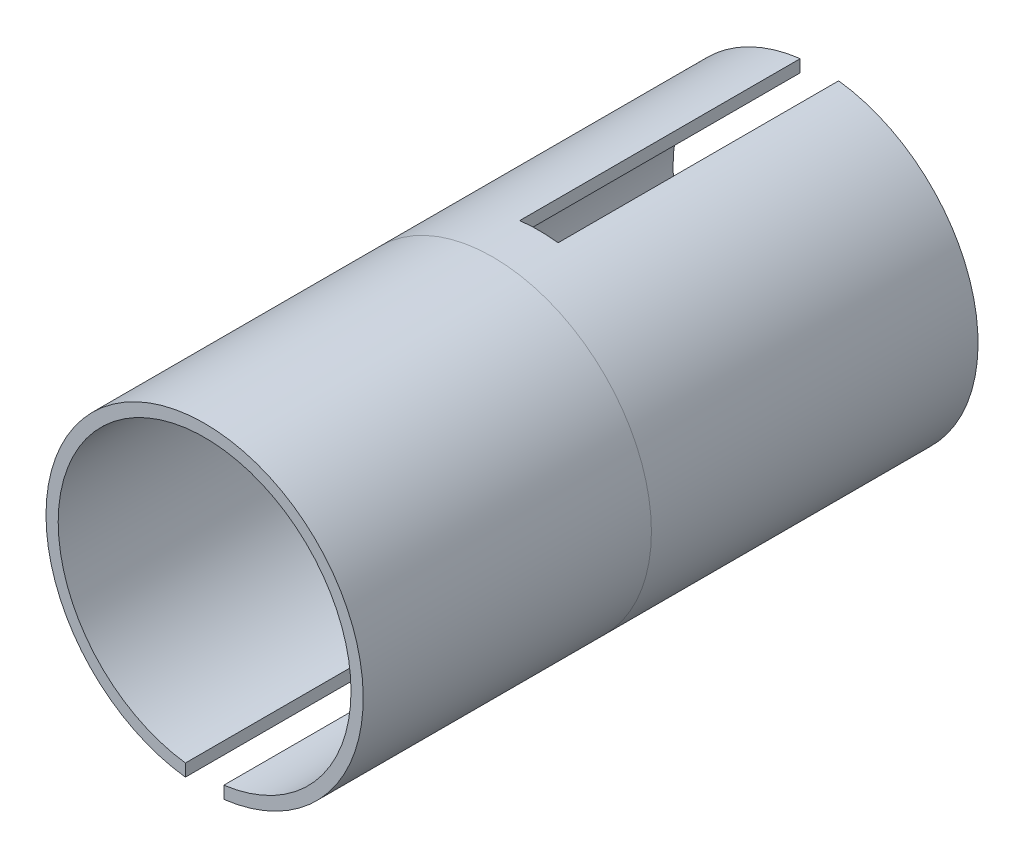
ISO-10303-21;
HEADER;
FILE_DESCRIPTION(('STEP AP214'),'2;1');
FILE_NAME('part.step','',(''),(''),'','','');
FILE_SCHEMA(('AUTOMOTIVE_DESIGN { 1 0 10303 214 1 1 1 1 }'));
ENDSEC;
DATA;
#1=APPLICATION_CONTEXT('core data for automotive mechanical design processes');
#2=APPLICATION_PROTOCOL_DEFINITION('international standard','automotive_design',2000,#1);
#3=PRODUCT_CONTEXT('',#1,'mechanical');
#4=PRODUCT('Part','Part','',(#3));
#5=PRODUCT_RELATED_PRODUCT_CATEGORY('part','',(#4));
#6=PRODUCT_DEFINITION_FORMATION('','',#4);
#7=PRODUCT_DEFINITION_CONTEXT('part definition',#1,'design');
#8=PRODUCT_DEFINITION('design','',#6,#7);
#9=PRODUCT_DEFINITION_SHAPE('','',#8);
#10=(LENGTH_UNIT() NAMED_UNIT(*) SI_UNIT(.MILLI.,.METRE.));
#11=(NAMED_UNIT(*) PLANE_ANGLE_UNIT() SI_UNIT($,.RADIAN.));
#12=(NAMED_UNIT(*) SI_UNIT($,.STERADIAN.) SOLID_ANGLE_UNIT());
#13=UNCERTAINTY_MEASURE_WITH_UNIT(LENGTH_MEASURE(1.E-05),#10,'distance_accuracy_value','');
#14=(GEOMETRIC_REPRESENTATION_CONTEXT(3) GLOBAL_UNCERTAINTY_ASSIGNED_CONTEXT((#13)) GLOBAL_UNIT_ASSIGNED_CONTEXT((#10,
#11,#12)) REPRESENTATION_CONTEXT('',''));
#15=CARTESIAN_POINT('',(0.,0.,0.));
#16=DIRECTION('',(0.,0.,1.));
#17=DIRECTION('',(1.,0.,0.));
#18=AXIS2_PLACEMENT_3D('',#15,#16,#17);
#19=CARTESIAN_POINT('',(0.,0.,85.));
#20=DIRECTION('',(0.,0.,-1.));
#21=DIRECTION('',(-1.,0.,0.));
#22=AXIS2_PLACEMENT_3D('',#19,#20,#21);
#23=PLANE('',#22);
#24=CARTESIAN_POINT('',(0.,0.,85.));
#25=DIRECTION('',(0.,0.,-1.));
#26=DIRECTION('',(-1.,0.,0.));
#27=AXIS2_PLACEMENT_3D('',#24,#25,#26);
#28=CIRCLE('',#27,41.275);
#29=CARTESIAN_POINT('',(-41.275,0.,85.));
#30=VERTEX_POINT('',#29);
#31=EDGE_CURVE('E57',#30,#30,#28,.T.);
#32=ORIENTED_EDGE('',*,*,#31,.T.);
#33=EDGE_LOOP('',(#32));
#34=FACE_BOUND('',#33,.T.);
#35=CARTESIAN_POINT('',(0.,0.,85.));
#36=DIRECTION('',(0.,0.,-1.));
#37=DIRECTION('',(-1.,0.,0.));
#38=AXIS2_PLACEMENT_3D('',#35,#36,#37);
#39=CIRCLE('',#38,38.1);
#40=CARTESIAN_POINT('',(-38.1,0.,85.));
#41=VERTEX_POINT('',#40);
#42=EDGE_CURVE('E125',#41,#41,#39,.T.);
#43=ORIENTED_EDGE('',*,*,#42,.F.);
#44=EDGE_LOOP('',(#43));
#45=FACE_BOUND('',#44,.T.);
#46=ADVANCED_FACE('F53',(#34,#45),#23,.T.);
#47=CARTESIAN_POINT('',(-5.,-50.,100.));
#48=DIRECTION('',(0.,0.,-1.));
#49=DIRECTION('',(-1.,0.,0.));
#50=AXIS2_PLACEMENT_3D('',#47,#48,#49);
#51=PLANE('',#50);
#52=DIRECTION('',(0.,1.,0.));
#53=VECTOR('',#52,1.);
#54=CARTESIAN_POINT('',(5.,-50.,100.));
#55=LINE('',#54,#53);
#56=CARTESIAN_POINT('',(5.,-40.9710339752367,100.));
#57=VERTEX_POINT('',#56);
#58=CARTESIAN_POINT('',(5.,-37.7704911273338,100.));
#59=VERTEX_POINT('',#58);
#60=EDGE_CURVE('E100',#57,#59,#55,.T.);
#61=ORIENTED_EDGE('',*,*,#60,.T.);
#62=CARTESIAN_POINT('',(0.,0.,100.));
#63=DIRECTION('',(0.,0.,-1.));
#64=DIRECTION('',(-1.,0.,0.));
#65=AXIS2_PLACEMENT_3D('',#62,#63,#64);
#66=CIRCLE('',#65,38.1);
#67=CARTESIAN_POINT('',(-5.,-37.7704911273338,100.));
#68=VERTEX_POINT('',#67);
#69=EDGE_CURVE('E97',#59,#68,#66,.T.);
#70=ORIENTED_EDGE('',*,*,#69,.T.);
#71=DIRECTION('',(0.,1.,0.));
#72=VECTOR('',#71,1.);
#73=CARTESIAN_POINT('',(-5.,-50.,100.));
#74=LINE('',#73,#72);
#75=CARTESIAN_POINT('',(-5.,-40.9710339752367,100.));
#76=VERTEX_POINT('',#75);
#77=EDGE_CURVE('E12',#76,#68,#74,.T.);
#78=ORIENTED_EDGE('',*,*,#77,.F.);
#79=CARTESIAN_POINT('',(0.,0.,100.));
#80=DIRECTION('',(0.,0.,-1.));
#81=DIRECTION('',(-1.,0.,0.));
#82=AXIS2_PLACEMENT_3D('',#79,#80,#81);
#83=CIRCLE('',#82,41.275);
#84=EDGE_CURVE('E116',#57,#76,#83,.T.);
#85=ORIENTED_EDGE('',*,*,#84,.F.);
#86=EDGE_LOOP('',(#61,#70,#78,#85));
#87=FACE_BOUND('',#86,.T.);
#88=ADVANCED_FACE('F98',(#87),#51,.F.);
#89=CARTESIAN_POINT('',(-5.,-50.,100.));
#90=DIRECTION('',(-1.,0.,0.));
#91=DIRECTION('',(0.,0.,1.));
#92=AXIS2_PLACEMENT_3D('',#89,#90,#91);
#93=PLANE('',#92);
#94=ORIENTED_EDGE('',*,*,#77,.T.);
#95=DIRECTION('',(0.,0.,-1.));
#96=VECTOR('',#95,1.);
#97=CARTESIAN_POINT('',(-5.,-37.7704911273338,160.));
#98=LINE('',#97,#96);
#99=CARTESIAN_POINT('',(-5.,-37.7704911273338,160.));
#100=VERTEX_POINT('',#99);
#101=EDGE_CURVE('E92',#68,#100,#98,.F.);
#102=ORIENTED_EDGE('',*,*,#101,.T.);
#103=DIRECTION('',(0.,1.,0.));
#104=VECTOR('',#103,1.);
#105=CARTESIAN_POINT('',(-5.,-50.,160.));
#106=LINE('',#105,#104);
#107=CARTESIAN_POINT('',(-5.,-40.9710339752367,160.));
#108=VERTEX_POINT('',#107);
#109=EDGE_CURVE('E62',#108,#100,#106,.T.);
#110=ORIENTED_EDGE('',*,*,#109,.F.);
#111=DIRECTION('',(0.,0.,-1.));
#112=VECTOR('',#111,1.);
#113=CARTESIAN_POINT('',(-5.,-40.9710339752367,160.));
#114=LINE('',#113,#112);
#115=EDGE_CURVE('E69',#76,#108,#114,.F.);
#116=ORIENTED_EDGE('',*,*,#115,.F.);
#117=EDGE_LOOP('',(#94,#102,#110,#116));
#118=FACE_BOUND('',#117,.T.);
#119=ADVANCED_FACE('F90',(#118),#93,.F.);
#120=CARTESIAN_POINT('',(0.,0.,160.));
#121=DIRECTION('',(0.,0.,1.));
#122=DIRECTION('',(1.,0.,0.));
#123=AXIS2_PLACEMENT_3D('',#120,#121,#122);
#124=PLANE('',#123);
#125=DIRECTION('',(0.,1.,0.));
#126=VECTOR('',#125,1.);
#127=CARTESIAN_POINT('',(5.,-50.,160.));
#128=LINE('',#127,#126);
#129=CARTESIAN_POINT('',(5.,-40.9710339752367,160.));
#130=VERTEX_POINT('',#129);
#131=CARTESIAN_POINT('',(5.,-37.7704911273338,160.));
#132=VERTEX_POINT('',#131);
#133=EDGE_CURVE('E123',#130,#132,#128,.T.);
#134=ORIENTED_EDGE('',*,*,#133,.F.);
#135=CARTESIAN_POINT('',(0.,0.,160.));
#136=DIRECTION('',(0.,0.,1.));
#137=DIRECTION('',(1.,0.,0.));
#138=AXIS2_PLACEMENT_3D('',#135,#136,#137);
#139=CIRCLE('',#138,41.275);
#140=EDGE_CURVE('E109',#130,#108,#139,.T.);
#141=ORIENTED_EDGE('',*,*,#140,.T.);
#142=ORIENTED_EDGE('',*,*,#109,.T.);
#143=CARTESIAN_POINT('',(0.,0.,160.));
#144=DIRECTION('',(0.,0.,1.));
#145=DIRECTION('',(1.,0.,0.));
#146=AXIS2_PLACEMENT_3D('',#143,#144,#145);
#147=CIRCLE('',#146,38.1);
#148=EDGE_CURVE('E108',#132,#100,#147,.T.);
#149=ORIENTED_EDGE('',*,*,#148,.F.);
#150=EDGE_LOOP('',(#134,#141,#142,#149));
#151=FACE_BOUND('',#150,.T.);
#152=ADVANCED_FACE('F148',(#151),#124,.T.);
#153=CARTESIAN_POINT('',(5.,-50.,160.));
#154=DIRECTION('',(1.,0.,0.));
#155=DIRECTION('',(0.,0.,-1.));
#156=AXIS2_PLACEMENT_3D('',#153,#154,#155);
#157=PLANE('',#156);
#158=ORIENTED_EDGE('',*,*,#133,.T.);
#159=DIRECTION('',(0.,0.,-1.));
#160=VECTOR('',#159,1.);
#161=CARTESIAN_POINT('',(5.,-37.7704911273338,160.));
#162=LINE('',#161,#160);
#163=EDGE_CURVE('E103',#132,#59,#162,.T.);
#164=ORIENTED_EDGE('',*,*,#163,.T.);
#165=ORIENTED_EDGE('',*,*,#60,.F.);
#166=DIRECTION('',(0.,0.,-1.));
#167=VECTOR('',#166,1.);
#168=CARTESIAN_POINT('',(5.,-40.9710339752367,160.));
#169=LINE('',#168,#167);
#170=EDGE_CURVE('E118',#130,#57,#169,.T.);
#171=ORIENTED_EDGE('',*,*,#170,.F.);
#172=EDGE_LOOP('',(#158,#164,#165,#171));
#173=FACE_BOUND('',#172,.T.);
#174=ADVANCED_FACE('F139',(#173),#157,.F.);
#175=CARTESIAN_POINT('',(0.,0.,160.));
#176=DIRECTION('',(0.,0.,-1.));
#177=DIRECTION('',(-1.,0.,0.));
#178=AXIS2_PLACEMENT_3D('',#175,#176,#177);
#179=CYLINDRICAL_SURFACE('',#178,38.1);
#180=ORIENTED_EDGE('',*,*,#163,.F.);
#181=ORIENTED_EDGE('',*,*,#148,.T.);
#182=ORIENTED_EDGE('',*,*,#101,.F.);
#183=ORIENTED_EDGE('',*,*,#69,.F.);
#184=EDGE_LOOP('',(#180,#181,#182,#183));
#185=FACE_BOUND('',#184,.T.);
#186=ORIENTED_EDGE('',*,*,#42,.T.);
#187=EDGE_LOOP('',(#186));
#188=FACE_BOUND('',#187,.T.);
#189=ADVANCED_FACE('F55',(#185,#188),#179,.F.);
#190=CARTESIAN_POINT('',(0.,0.,160.));
#191=DIRECTION('',(0.,0.,-1.));
#192=DIRECTION('',(-1.,0.,0.));
#193=AXIS2_PLACEMENT_3D('',#190,#191,#192);
#194=CYLINDRICAL_SURFACE('',#193,41.275);
#195=ORIENTED_EDGE('',*,*,#140,.F.);
#196=ORIENTED_EDGE('',*,*,#170,.T.);
#197=ORIENTED_EDGE('',*,*,#84,.T.);
#198=ORIENTED_EDGE('',*,*,#115,.T.);
#199=EDGE_LOOP('',(#195,#196,#197,#198));
#200=FACE_BOUND('',#199,.T.);
#201=ORIENTED_EDGE('',*,*,#31,.F.);
#202=EDGE_LOOP('',(#201));
#203=FACE_BOUND('',#202,.T.);
#204=ADVANCED_FACE('F133',(#200,#203),#194,.T.);
#205=CLOSED_SHELL('',(#46,#88,#119,#152,#174,#189,#204));
#206=MANIFOLD_SOLID_BREP('B2',#205);
#207=CARTESIAN_POINT('',(0.,0.,85.));
#208=DIRECTION('',(0.,0.,-1.));
#209=DIRECTION('',(-1.,0.,0.));
#210=AXIS2_PLACEMENT_3D('',#207,#208,#209);
#211=PLANE('',#210);
#212=CARTESIAN_POINT('',(0.,0.,85.));
#213=DIRECTION('',(0.,0.,-1.));
#214=DIRECTION('',(-1.,0.,0.));
#215=AXIS2_PLACEMENT_3D('',#212,#213,#214);
#216=CIRCLE('',#215,38.1);
#217=CARTESIAN_POINT('',(-38.1,0.,85.));
#218=VERTEX_POINT('',#217);
#219=EDGE_CURVE('E51',#218,#218,#216,.T.);
#220=ORIENTED_EDGE('',*,*,#219,.T.);
#221=EDGE_LOOP('',(#220));
#222=FACE_BOUND('',#221,.T.);
#223=CARTESIAN_POINT('',(0.,0.,85.));
#224=DIRECTION('',(0.,0.,-1.));
#225=DIRECTION('',(-1.,0.,0.));
#226=AXIS2_PLACEMENT_3D('',#223,#224,#225);
#227=CIRCLE('',#226,41.275);
#228=CARTESIAN_POINT('',(-41.275,0.,85.));
#229=VERTEX_POINT('',#228);
#230=EDGE_CURVE('E199',#229,#229,#227,.T.);
#231=ORIENTED_EDGE('',*,*,#230,.F.);
#232=EDGE_LOOP('',(#231));
#233=FACE_BOUND('',#232,.T.);
#234=ADVANCED_FACE('F196',(#222,#233),#211,.F.);
#235=CARTESIAN_POINT('',(0.,0.,0.));
#236=DIRECTION('',(0.,0.,1.));
#237=DIRECTION('',(1.,0.,0.));
#238=AXIS2_PLACEMENT_3D('',#235,#236,#237);
#239=PLANE('',#238);
#240=DIRECTION('',(0.,-1.,0.));
#241=VECTOR('',#240,1.);
#242=CARTESIAN_POINT('',(5.,50.,0.));
#243=LINE('',#242,#241);
#244=CARTESIAN_POINT('',(5.,40.9710339752367,0.));
#245=VERTEX_POINT('',#244);
#246=CARTESIAN_POINT('',(5.,37.7704911273338,0.));
#247=VERTEX_POINT('',#246);
#248=EDGE_CURVE('E217',#245,#247,#243,.T.);
#249=ORIENTED_EDGE('',*,*,#248,.F.);
#250=CARTESIAN_POINT('',(0.,0.,0.));
#251=DIRECTION('',(0.,0.,1.));
#252=DIRECTION('',(1.,0.,0.));
#253=AXIS2_PLACEMENT_3D('',#250,#251,#252);
#254=CIRCLE('',#253,41.275);
#255=CARTESIAN_POINT('',(-5.,40.9710339752367,0.));
#256=VERTEX_POINT('',#255);
#257=EDGE_CURVE('E252',#256,#245,#254,.T.);
#258=ORIENTED_EDGE('',*,*,#257,.F.);
#259=DIRECTION('',(0.,-1.,0.));
#260=VECTOR('',#259,1.);
#261=CARTESIAN_POINT('',(-5.,50.,0.));
#262=LINE('',#261,#260);
#263=CARTESIAN_POINT('',(-5.,37.7704911273338,0.));
#264=VERTEX_POINT('',#263);
#265=EDGE_CURVE('E341',#256,#264,#262,.T.);
#266=ORIENTED_EDGE('',*,*,#265,.T.);
#267=CARTESIAN_POINT('',(0.,0.,0.));
#268=DIRECTION('',(0.,0.,1.));
#269=DIRECTION('',(1.,0.,0.));
#270=AXIS2_PLACEMENT_3D('',#267,#268,#269);
#271=CIRCLE('',#270,38.1);
#272=EDGE_CURVE('E253',#264,#247,#271,.T.);
#273=ORIENTED_EDGE('',*,*,#272,.T.);
#274=EDGE_LOOP('',(#249,#258,#266,#273));
#275=FACE_BOUND('',#274,.T.);
#276=ADVANCED_FACE('F271',(#275),#239,.F.);
#277=CARTESIAN_POINT('',(0.,0.,160.));
#278=DIRECTION('',(0.,0.,-1.));
#279=DIRECTION('',(-1.,0.,0.));
#280=AXIS2_PLACEMENT_3D('',#277,#278,#279);
#281=CYLINDRICAL_SURFACE('',#280,41.275);
#282=ORIENTED_EDGE('',*,*,#230,.T.);
#283=EDGE_LOOP('',(#282));
#284=FACE_BOUND('',#283,.T.);
#285=DIRECTION('',(0.,0.,-1.));
#286=VECTOR('',#285,1.);
#287=CARTESIAN_POINT('',(5.00000000000002,40.9710339752367,160.));
#288=LINE('',#287,#286);
#289=CARTESIAN_POINT('',(5.,40.9710339752367,73.));
#290=VERTEX_POINT('',#289);
#291=EDGE_CURVE('E245',#290,#245,#288,.T.);
#292=ORIENTED_EDGE('',*,*,#291,.F.);
#293=CARTESIAN_POINT('',(0.,0.,73.));
#294=DIRECTION('',(0.,0.,-1.));
#295=DIRECTION('',(-1.,0.,0.));
#296=AXIS2_PLACEMENT_3D('',#293,#294,#295);
#297=CIRCLE('',#296,41.275);
#298=CARTESIAN_POINT('',(-5.,40.9710339752367,73.));
#299=VERTEX_POINT('',#298);
#300=EDGE_CURVE('E235',#299,#290,#297,.T.);
#301=ORIENTED_EDGE('',*,*,#300,.F.);
#302=DIRECTION('',(0.,0.,-1.));
#303=VECTOR('',#302,1.);
#304=CARTESIAN_POINT('',(-5.,40.9710339752367,160.));
#305=LINE('',#304,#303);
#306=EDGE_CURVE('E242',#299,#256,#305,.T.);
#307=ORIENTED_EDGE('',*,*,#306,.T.);
#308=ORIENTED_EDGE('',*,*,#257,.T.);
#309=EDGE_LOOP('',(#292,#301,#307,#308));
#310=FACE_BOUND('',#309,.T.);
#311=ADVANCED_FACE('F250',(#284,#310),#281,.T.);
#312=CARTESIAN_POINT('',(0.,0.,160.));
#313=DIRECTION('',(0.,0.,-1.));
#314=DIRECTION('',(-1.,0.,0.));
#315=AXIS2_PLACEMENT_3D('',#312,#313,#314);
#316=CYLINDRICAL_SURFACE('',#315,38.1);
#317=ORIENTED_EDGE('',*,*,#219,.F.);
#318=EDGE_LOOP('',(#317));
#319=FACE_BOUND('',#318,.T.);
#320=CARTESIAN_POINT('',(0.,0.,73.));
#321=DIRECTION('',(0.,0.,-1.));
#322=DIRECTION('',(-1.,0.,0.));
#323=AXIS2_PLACEMENT_3D('',#320,#321,#322);
#324=CIRCLE('',#323,38.1);
#325=CARTESIAN_POINT('',(-5.,37.7704911273338,73.));
#326=VERTEX_POINT('',#325);
#327=CARTESIAN_POINT('',(5.,37.7704911273338,73.));
#328=VERTEX_POINT('',#327);
#329=EDGE_CURVE('E260',#326,#328,#324,.T.);
#330=ORIENTED_EDGE('',*,*,#329,.T.);
#331=DIRECTION('',(0.,0.,-1.));
#332=VECTOR('',#331,1.);
#333=CARTESIAN_POINT('',(5.00000000000002,37.7704911273338,160.));
#334=LINE('',#333,#332);
#335=EDGE_CURVE('E246',#328,#247,#334,.T.);
#336=ORIENTED_EDGE('',*,*,#335,.T.);
#337=ORIENTED_EDGE('',*,*,#272,.F.);
#338=DIRECTION('',(0.,0.,-1.));
#339=VECTOR('',#338,1.);
#340=CARTESIAN_POINT('',(-5.,37.7704911273338,160.));
#341=LINE('',#340,#339);
#342=EDGE_CURVE('E262',#326,#264,#341,.T.);
#343=ORIENTED_EDGE('',*,*,#342,.F.);
#344=EDGE_LOOP('',(#330,#336,#337,#343));
#345=FACE_BOUND('',#344,.T.);
#346=ADVANCED_FACE('F291',(#319,#345),#316,.F.);
#347=CARTESIAN_POINT('',(4.99999999999999,50.,0.));
#348=DIRECTION('',(-1.,0.,0.));
#349=DIRECTION('',(0.,0.,1.));
#350=AXIS2_PLACEMENT_3D('',#347,#348,#349);
#351=PLANE('',#350);
#352=ORIENTED_EDGE('',*,*,#291,.T.);
#353=ORIENTED_EDGE('',*,*,#248,.T.);
#354=ORIENTED_EDGE('',*,*,#335,.F.);
#355=DIRECTION('',(0.,-1.,0.));
#356=VECTOR('',#355,1.);
#357=CARTESIAN_POINT('',(5.,50.,73.));
#358=LINE('',#357,#356);
#359=EDGE_CURVE('E210',#290,#328,#358,.T.);
#360=ORIENTED_EDGE('',*,*,#359,.F.);
#361=EDGE_LOOP('',(#352,#353,#354,#360));
#362=FACE_BOUND('',#361,.T.);
#363=ADVANCED_FACE('F244',(#362),#351,.T.);
#364=CARTESIAN_POINT('',(-5.,50.,0.));
#365=DIRECTION('',(-1.,0.,0.));
#366=DIRECTION('',(0.,0.,1.));
#367=AXIS2_PLACEMENT_3D('',#364,#365,#366);
#368=PLANE('',#367);
#369=DIRECTION('',(0.,-1.,0.));
#370=VECTOR('',#369,1.);
#371=CARTESIAN_POINT('',(-5.,50.,73.));
#372=LINE('',#371,#370);
#373=EDGE_CURVE('E238',#299,#326,#372,.T.);
#374=ORIENTED_EDGE('',*,*,#373,.T.);
#375=ORIENTED_EDGE('',*,*,#342,.T.);
#376=ORIENTED_EDGE('',*,*,#265,.F.);
#377=ORIENTED_EDGE('',*,*,#306,.F.);
#378=EDGE_LOOP('',(#374,#375,#376,#377));
#379=FACE_BOUND('',#378,.T.);
#380=ADVANCED_FACE('F281',(#379),#368,.F.);
#381=CARTESIAN_POINT('',(0.,50.,73.));
#382=DIRECTION('',(0.,0.,-1.));
#383=DIRECTION('',(-1.,0.,0.));
#384=AXIS2_PLACEMENT_3D('',#381,#382,#383);
#385=PLANE('',#384);
#386=ORIENTED_EDGE('',*,*,#300,.T.);
#387=ORIENTED_EDGE('',*,*,#359,.T.);
#388=ORIENTED_EDGE('',*,*,#329,.F.);
#389=ORIENTED_EDGE('',*,*,#373,.F.);
#390=EDGE_LOOP('',(#386,#387,#388,#389));
#391=FACE_BOUND('',#390,.T.);
#392=ADVANCED_FACE('F236',(#391),#385,.T.);
#393=CLOSED_SHELL('',(#234,#276,#311,#346,#363,#380,#392));
#394=MANIFOLD_SOLID_BREP('B6',#393);
#395=ADVANCED_BREP_SHAPE_REPRESENTATION('',(#18,#206,#394),#14);
#396=SHAPE_DEFINITION_REPRESENTATION(#9,#395);
ENDSEC;
END-ISO-10303-21;
